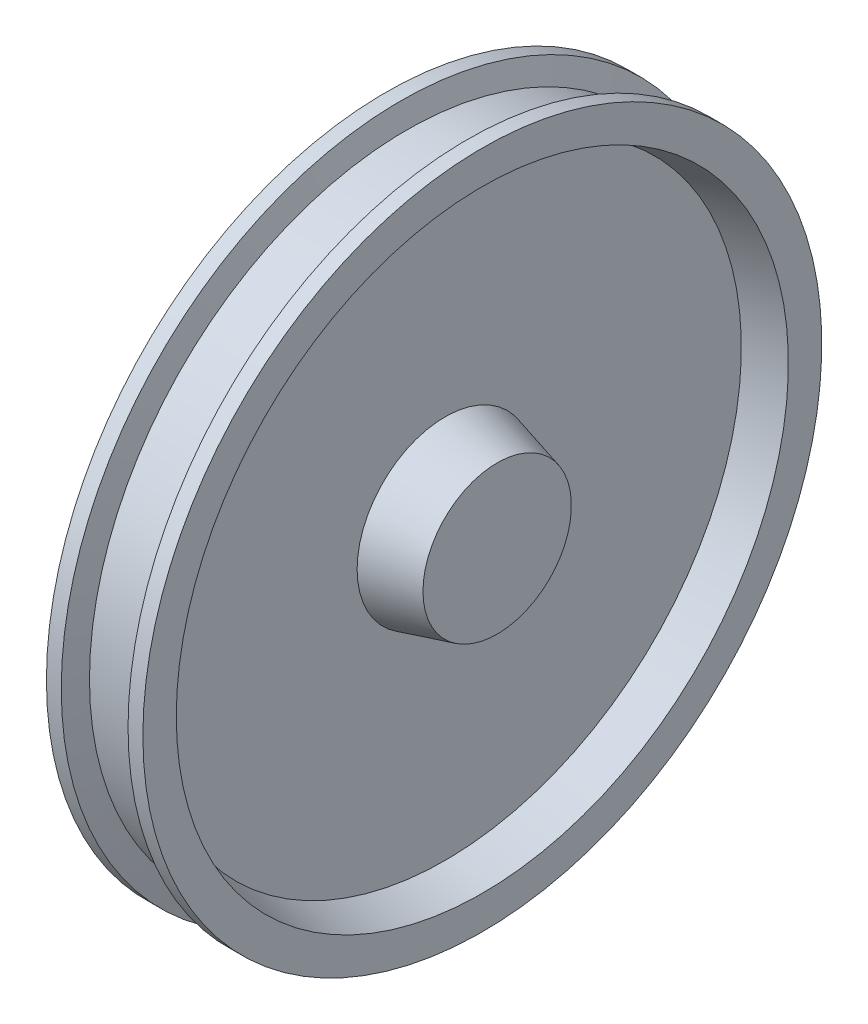
ISO-10303-21;
HEADER;
FILE_DESCRIPTION(('STEP AP214'),'2;1');
FILE_NAME('part.step','',(''),(''),'','','');
FILE_SCHEMA(('AUTOMOTIVE_DESIGN { 1 0 10303 214 1 1 1 1 }'));
ENDSEC;
DATA;
#1=APPLICATION_CONTEXT('core data for automotive mechanical design processes');
#2=APPLICATION_PROTOCOL_DEFINITION('international standard','automotive_design',2000,#1);
#3=PRODUCT_CONTEXT('',#1,'mechanical');
#4=PRODUCT('Part','Part','',(#3));
#5=PRODUCT_RELATED_PRODUCT_CATEGORY('part','',(#4));
#6=PRODUCT_DEFINITION_FORMATION('','',#4);
#7=PRODUCT_DEFINITION_CONTEXT('part definition',#1,'design');
#8=PRODUCT_DEFINITION('design','',#6,#7);
#9=PRODUCT_DEFINITION_SHAPE('','',#8);
#10=(LENGTH_UNIT() NAMED_UNIT(*) SI_UNIT(.MILLI.,.METRE.));
#11=(NAMED_UNIT(*) PLANE_ANGLE_UNIT() SI_UNIT($,.RADIAN.));
#12=(NAMED_UNIT(*) SI_UNIT($,.STERADIAN.) SOLID_ANGLE_UNIT());
#13=UNCERTAINTY_MEASURE_WITH_UNIT(LENGTH_MEASURE(1.E-05),#10,'distance_accuracy_value','');
#14=(GEOMETRIC_REPRESENTATION_CONTEXT(3) GLOBAL_UNCERTAINTY_ASSIGNED_CONTEXT((#13)) GLOBAL_UNIT_ASSIGNED_CONTEXT((#10,
#11,#12)) REPRESENTATION_CONTEXT('',''));
#15=CARTESIAN_POINT('',(0.,0.,0.));
#16=DIRECTION('',(0.,0.,1.));
#17=DIRECTION('',(1.,0.,0.));
#18=AXIS2_PLACEMENT_3D('',#15,#16,#17);
#19=CARTESIAN_POINT('',(-15.,0.,0.));
#20=DIRECTION('',(1.,0.,0.));
#21=DIRECTION('',(0.,0.,-1.));
#22=AXIS2_PLACEMENT_3D('',#19,#20,#21);
#23=CONICAL_SURFACE('',#22,118.756443470178,0.261799387799143);
#24=CARTESIAN_POINT('',(-85.,0.,0.));
#25=DIRECTION('',(-1.,0.,0.));
#26=DIRECTION('',(0.,0.,1.));
#27=AXIS2_PLACEMENT_3D('',#24,#25,#26);
#28=CIRCLE('',#27,100.);
#29=CARTESIAN_POINT('',(-85.,0.,100.));
#30=VERTEX_POINT('',#29);
#31=EDGE_CURVE('E77',#30,#30,#28,.T.);
#32=ORIENTED_EDGE('',*,*,#31,.F.);
#33=EDGE_LOOP('',(#32));
#34=FACE_BOUND('',#33,.T.);
#35=CARTESIAN_POINT('',(-15.,0.,0.));
#36=DIRECTION('',(-1.,0.,0.));
#37=DIRECTION('',(0.,0.,1.));
#38=AXIS2_PLACEMENT_3D('',#35,#36,#37);
#39=CIRCLE('',#38,118.756443470178);
#40=CARTESIAN_POINT('',(-15.,0.,118.756443470178));
#41=VERTEX_POINT('',#40);
#42=EDGE_CURVE('E10',#41,#41,#39,.T.);
#43=ORIENTED_EDGE('',*,*,#42,.T.);
#44=EDGE_LOOP('',(#43));
#45=FACE_BOUND('',#44,.T.);
#46=ADVANCED_FACE('F31',(#34,#45),#23,.T.);
#47=CARTESIAN_POINT('',(-15.,0.,-118.756443470178));
#48=DIRECTION('',(1.,0.,0.));
#49=DIRECTION('',(0.,0.,-1.));
#50=AXIS2_PLACEMENT_3D('',#47,#48,#49);
#51=PLANE('',#50);
#52=ORIENTED_EDGE('',*,*,#42,.F.);
#53=EDGE_LOOP('',(#52));
#54=FACE_BOUND('',#53,.T.);
#55=CARTESIAN_POINT('',(-15.0000000000001,0.,0.));
#56=DIRECTION('',(-1.,0.,0.));
#57=DIRECTION('',(0.,0.,1.));
#58=AXIS2_PLACEMENT_3D('',#55,#56,#57);
#59=CIRCLE('',#58,399.102540378444);
#60=CARTESIAN_POINT('',(-15.0000000000001,0.,399.102540378444));
#61=VERTEX_POINT('',#60);
#62=EDGE_CURVE('E37',#61,#61,#59,.T.);
#63=ORIENTED_EDGE('',*,*,#62,.T.);
#64=EDGE_LOOP('',(#63));
#65=FACE_BOUND('',#64,.T.);
#66=ADVANCED_FACE('F84',(#54,#65),#51,.F.);
#67=CARTESIAN_POINT('',(-65.,0.,0.));
#68=DIRECTION('',(-1.,0.,0.));
#69=DIRECTION('',(0.,0.,1.));
#70=AXIS2_PLACEMENT_3D('',#67,#68,#69);
#71=CONICAL_SURFACE('',#70,412.5,0.261799387799151);
#72=ORIENTED_EDGE('',*,*,#62,.F.);
#73=EDGE_LOOP('',(#72));
#74=FACE_BOUND('',#73,.T.);
#75=CARTESIAN_POINT('',(-65.,0.,0.));
#76=DIRECTION('',(-1.,0.,0.));
#77=DIRECTION('',(0.,0.,1.));
#78=AXIS2_PLACEMENT_3D('',#75,#76,#77);
#79=CIRCLE('',#78,412.5);
#80=CARTESIAN_POINT('',(-65.,0.,412.5));
#81=VERTEX_POINT('',#80);
#82=EDGE_CURVE('E41',#81,#81,#79,.T.);
#83=ORIENTED_EDGE('',*,*,#82,.T.);
#84=EDGE_LOOP('',(#83));
#85=FACE_BOUND('',#84,.T.);
#86=ADVANCED_FACE('F88',(#74,#85),#71,.F.);
#87=CARTESIAN_POINT('',(-65.0000000000001,0.,-412.5));
#88=DIRECTION('',(1.,0.,0.));
#89=DIRECTION('',(0.,0.,-1.));
#90=AXIS2_PLACEMENT_3D('',#87,#88,#89);
#91=PLANE('',#90);
#92=ORIENTED_EDGE('',*,*,#82,.F.);
#93=EDGE_LOOP('',(#92));
#94=FACE_BOUND('',#93,.T.);
#95=CARTESIAN_POINT('',(-65.0000000000001,0.,0.));
#96=DIRECTION('',(-1.,0.,0.));
#97=DIRECTION('',(0.,0.,1.));
#98=AXIS2_PLACEMENT_3D('',#95,#96,#97);
#99=CIRCLE('',#98,457.5);
#100=CARTESIAN_POINT('',(-65.0000000000001,0.,457.5));
#101=VERTEX_POINT('',#100);
#102=EDGE_CURVE('E45',#101,#101,#99,.T.);
#103=ORIENTED_EDGE('',*,*,#102,.T.);
#104=EDGE_LOOP('',(#103));
#105=FACE_BOUND('',#104,.T.);
#106=ADVANCED_FACE('F93',(#94,#105),#91,.F.);
#107=CARTESIAN_POINT('',(-85.,0.,0.));
#108=DIRECTION('',(-1.,0.,0.));
#109=DIRECTION('',(0.,0.,1.));
#110=AXIS2_PLACEMENT_3D('',#107,#108,#109);
#111=CYLINDRICAL_SURFACE('',#110,457.5);
#112=ORIENTED_EDGE('',*,*,#102,.F.);
#113=EDGE_LOOP('',(#112));
#114=FACE_BOUND('',#113,.T.);
#115=CARTESIAN_POINT('',(-45.0000000000001,0.,0.));
#116=DIRECTION('',(-1.,0.,0.));
#117=DIRECTION('',(0.,0.,1.));
#118=AXIS2_PLACEMENT_3D('',#115,#116,#117);
#119=CIRCLE('',#118,457.5);
#120=CARTESIAN_POINT('',(-45.0000000000001,0.,457.5));
#121=VERTEX_POINT('',#120);
#122=EDGE_CURVE('E50',#121,#121,#119,.T.);
#123=ORIENTED_EDGE('',*,*,#122,.T.);
#124=EDGE_LOOP('',(#123));
#125=FACE_BOUND('',#124,.T.);
#126=ADVANCED_FACE('F99',(#114,#125),#111,.T.);
#127=CARTESIAN_POINT('',(-36.9615242270664,0.,0.));
#128=DIRECTION('',(-1.,0.,0.));
#129=DIRECTION('',(0.,0.,1.));
#130=AXIS2_PLACEMENT_3D('',#127,#128,#129);
#131=CONICAL_SURFACE('',#130,427.5,1.30899693899575);
#132=ORIENTED_EDGE('',*,*,#122,.F.);
#133=EDGE_LOOP('',(#132));
#134=FACE_BOUND('',#133,.T.);
#135=CARTESIAN_POINT('',(-36.9615242270664,0.,0.));
#136=DIRECTION('',(-1.,0.,0.));
#137=DIRECTION('',(0.,0.,1.));
#138=AXIS2_PLACEMENT_3D('',#135,#136,#137);
#139=CIRCLE('',#138,427.5);
#140=CARTESIAN_POINT('',(-36.9615242270664,0.,427.5));
#141=VERTEX_POINT('',#140);
#142=EDGE_CURVE('E53',#141,#141,#139,.T.);
#143=ORIENTED_EDGE('',*,*,#142,.T.);
#144=EDGE_LOOP('',(#143));
#145=FACE_BOUND('',#144,.T.);
#146=ADVANCED_FACE('F103',(#134,#145),#131,.T.);
#147=CARTESIAN_POINT('',(-85.,0.,0.));
#148=DIRECTION('',(-1.,0.,0.));
#149=DIRECTION('',(0.,0.,1.));
#150=AXIS2_PLACEMENT_3D('',#147,#148,#149);
#151=CYLINDRICAL_SURFACE('',#150,427.5);
#152=ORIENTED_EDGE('',*,*,#142,.F.);
#153=EDGE_LOOP('',(#152));
#154=FACE_BOUND('',#153,.T.);
#155=CARTESIAN_POINT('',(36.9615242270663,0.,0.));
#156=DIRECTION('',(-1.,0.,0.));
#157=DIRECTION('',(0.,0.,1.));
#158=AXIS2_PLACEMENT_3D('',#155,#156,#157);
#159=CIRCLE('',#158,427.5);
#160=CARTESIAN_POINT('',(36.9615242270663,0.,427.5));
#161=VERTEX_POINT('',#160);
#162=EDGE_CURVE('E56',#161,#161,#159,.T.);
#163=ORIENTED_EDGE('',*,*,#162,.T.);
#164=EDGE_LOOP('',(#163));
#165=FACE_BOUND('',#164,.T.);
#166=ADVANCED_FACE('F107',(#154,#165),#151,.T.);
#167=CARTESIAN_POINT('',(45.,0.,0.));
#168=DIRECTION('',(1.,0.,0.));
#169=DIRECTION('',(0.,0.,-1.));
#170=AXIS2_PLACEMENT_3D('',#167,#168,#169);
#171=CONICAL_SURFACE('',#170,457.5,1.30899693899575);
#172=ORIENTED_EDGE('',*,*,#162,.F.);
#173=EDGE_LOOP('',(#172));
#174=FACE_BOUND('',#173,.T.);
#175=CARTESIAN_POINT('',(45.,0.,0.));
#176=DIRECTION('',(-1.,0.,0.));
#177=DIRECTION('',(0.,0.,1.));
#178=AXIS2_PLACEMENT_3D('',#175,#176,#177);
#179=CIRCLE('',#178,457.5);
#180=CARTESIAN_POINT('',(45.,0.,457.5));
#181=VERTEX_POINT('',#180);
#182=EDGE_CURVE('E59',#181,#181,#179,.T.);
#183=ORIENTED_EDGE('',*,*,#182,.T.);
#184=EDGE_LOOP('',(#183));
#185=FACE_BOUND('',#184,.T.);
#186=ADVANCED_FACE('F111',(#174,#185),#171,.T.);
#187=CARTESIAN_POINT('',(-85.,0.,0.));
#188=DIRECTION('',(-1.,0.,0.));
#189=DIRECTION('',(0.,0.,1.));
#190=AXIS2_PLACEMENT_3D('',#187,#188,#189);
#191=CYLINDRICAL_SURFACE('',#190,457.5);
#192=ORIENTED_EDGE('',*,*,#182,.F.);
#193=EDGE_LOOP('',(#192));
#194=FACE_BOUND('',#193,.T.);
#195=CARTESIAN_POINT('',(65.,0.,0.));
#196=DIRECTION('',(-1.,0.,0.));
#197=DIRECTION('',(0.,0.,1.));
#198=AXIS2_PLACEMENT_3D('',#195,#196,#197);
#199=CIRCLE('',#198,457.5);
#200=CARTESIAN_POINT('',(65.,0.,457.5));
#201=VERTEX_POINT('',#200);
#202=EDGE_CURVE('E62',#201,#201,#199,.T.);
#203=ORIENTED_EDGE('',*,*,#202,.T.);
#204=EDGE_LOOP('',(#203));
#205=FACE_BOUND('',#204,.T.);
#206=ADVANCED_FACE('F115',(#194,#205),#191,.T.);
#207=CARTESIAN_POINT('',(65.,0.,-412.5));
#208=DIRECTION('',(-1.,0.,0.));
#209=DIRECTION('',(0.,0.,1.));
#210=AXIS2_PLACEMENT_3D('',#207,#208,#209);
#211=PLANE('',#210);
#212=ORIENTED_EDGE('',*,*,#202,.F.);
#213=EDGE_LOOP('',(#212));
#214=FACE_BOUND('',#213,.T.);
#215=CARTESIAN_POINT('',(65.,0.,0.));
#216=DIRECTION('',(-1.,0.,0.));
#217=DIRECTION('',(0.,0.,1.));
#218=AXIS2_PLACEMENT_3D('',#215,#216,#217);
#219=CIRCLE('',#218,412.5);
#220=CARTESIAN_POINT('',(65.,0.,412.5));
#221=VERTEX_POINT('',#220);
#222=EDGE_CURVE('E65',#221,#221,#219,.T.);
#223=ORIENTED_EDGE('',*,*,#222,.T.);
#224=EDGE_LOOP('',(#223));
#225=FACE_BOUND('',#224,.T.);
#226=ADVANCED_FACE('F119',(#214,#225),#211,.F.);
#227=CARTESIAN_POINT('',(15.,0.,0.));
#228=DIRECTION('',(1.,0.,0.));
#229=DIRECTION('',(0.,0.,-1.));
#230=AXIS2_PLACEMENT_3D('',#227,#228,#229);
#231=CONICAL_SURFACE('',#230,399.102540378444,0.261799387799151);
#232=ORIENTED_EDGE('',*,*,#222,.F.);
#233=EDGE_LOOP('',(#232));
#234=FACE_BOUND('',#233,.T.);
#235=CARTESIAN_POINT('',(15.,0.,0.));
#236=DIRECTION('',(-1.,0.,0.));
#237=DIRECTION('',(0.,0.,1.));
#238=AXIS2_PLACEMENT_3D('',#235,#236,#237);
#239=CIRCLE('',#238,399.102540378444);
#240=CARTESIAN_POINT('',(15.,0.,399.102540378444));
#241=VERTEX_POINT('',#240);
#242=EDGE_CURVE('E68',#241,#241,#239,.T.);
#243=ORIENTED_EDGE('',*,*,#242,.T.);
#244=EDGE_LOOP('',(#243));
#245=FACE_BOUND('',#244,.T.);
#246=ADVANCED_FACE('F123',(#234,#245),#231,.F.);
#247=CARTESIAN_POINT('',(15.,0.,-118.756443470178));
#248=DIRECTION('',(-1.,0.,0.));
#249=DIRECTION('',(0.,0.,1.));
#250=AXIS2_PLACEMENT_3D('',#247,#248,#249);
#251=PLANE('',#250);
#252=ORIENTED_EDGE('',*,*,#242,.F.);
#253=EDGE_LOOP('',(#252));
#254=FACE_BOUND('',#253,.T.);
#255=CARTESIAN_POINT('',(15.,0.,0.));
#256=DIRECTION('',(-1.,0.,0.));
#257=DIRECTION('',(0.,0.,1.));
#258=AXIS2_PLACEMENT_3D('',#255,#256,#257);
#259=CIRCLE('',#258,118.756443470178);
#260=CARTESIAN_POINT('',(15.,0.,118.756443470178));
#261=VERTEX_POINT('',#260);
#262=EDGE_CURVE('E71',#261,#261,#259,.T.);
#263=ORIENTED_EDGE('',*,*,#262,.T.);
#264=EDGE_LOOP('',(#263));
#265=FACE_BOUND('',#264,.T.);
#266=ADVANCED_FACE('F127',(#254,#265),#251,.F.);
#267=CARTESIAN_POINT('',(85.,0.,0.));
#268=DIRECTION('',(-1.,0.,0.));
#269=DIRECTION('',(0.,0.,1.));
#270=AXIS2_PLACEMENT_3D('',#267,#268,#269);
#271=CONICAL_SURFACE('',#270,100.,0.261799387799143);
#272=ORIENTED_EDGE('',*,*,#262,.F.);
#273=EDGE_LOOP('',(#272));
#274=FACE_BOUND('',#273,.T.);
#275=CARTESIAN_POINT('',(85.,0.,0.));
#276=DIRECTION('',(-1.,0.,0.));
#277=DIRECTION('',(0.,0.,1.));
#278=AXIS2_PLACEMENT_3D('',#275,#276,#277);
#279=CIRCLE('',#278,100.);
#280=CARTESIAN_POINT('',(85.,0.,100.));
#281=VERTEX_POINT('',#280);
#282=EDGE_CURVE('E74',#281,#281,#279,.T.);
#283=ORIENTED_EDGE('',*,*,#282,.T.);
#284=EDGE_LOOP('',(#283));
#285=FACE_BOUND('',#284,.T.);
#286=ADVANCED_FACE('F131',(#274,#285),#271,.T.);
#287=CARTESIAN_POINT('',(85.,0.,0.));
#288=DIRECTION('',(-1.,0.,0.));
#289=DIRECTION('',(0.,0.,1.));
#290=AXIS2_PLACEMENT_3D('',#287,#288,#289);
#291=PLANE('',#290);
#292=ORIENTED_EDGE('',*,*,#282,.F.);
#293=EDGE_LOOP('',(#292));
#294=FACE_BOUND('',#293,.T.);
#295=ADVANCED_FACE('F135',(#294),#291,.F.);
#296=CARTESIAN_POINT('',(-85.,0.,0.));
#297=DIRECTION('',(1.,0.,0.));
#298=DIRECTION('',(0.,0.,-1.));
#299=AXIS2_PLACEMENT_3D('',#296,#297,#298);
#300=PLANE('',#299);
#301=ORIENTED_EDGE('',*,*,#31,.T.);
#302=EDGE_LOOP('',(#301));
#303=FACE_BOUND('',#302,.T.);
#304=ADVANCED_FACE('F81',(#303),#300,.F.);
#305=CLOSED_SHELL('',(#46,#66,#86,#106,#126,#146,#166,#186,#206,#226,#246,#266,#286,#295,#304));
#306=MANIFOLD_SOLID_BREP('B2',#305);
#307=ADVANCED_BREP_SHAPE_REPRESENTATION('',(#18,#306),#14);
#308=SHAPE_DEFINITION_REPRESENTATION(#9,#307);
ENDSEC;
END-ISO-10303-21;
